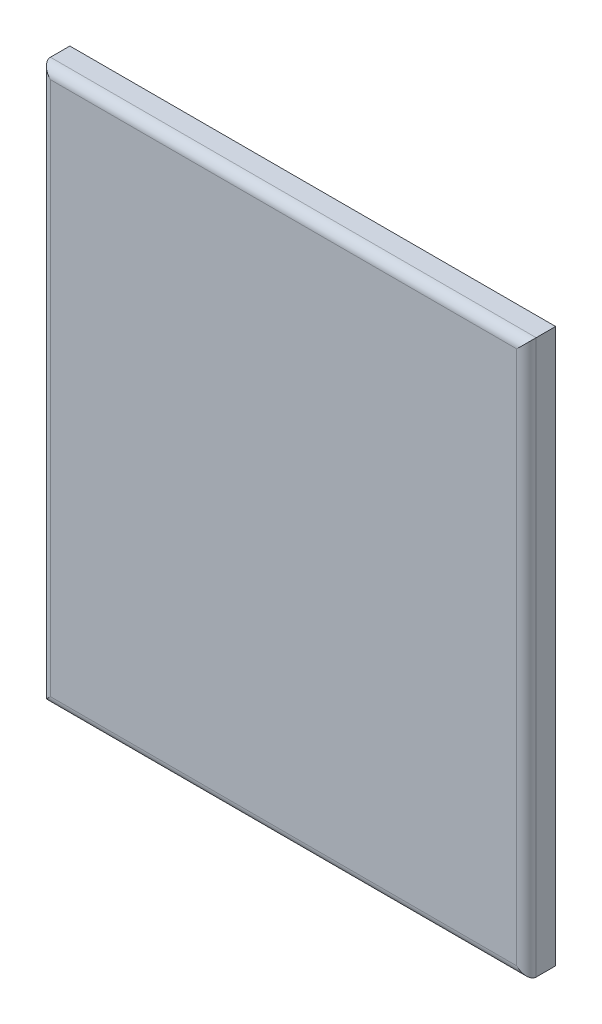
ISO-10303-21;
HEADER;
FILE_DESCRIPTION(('STEP AP214'),'2;1');
FILE_NAME('part.step','',(''),(''),'','','');
FILE_SCHEMA(('AUTOMOTIVE_DESIGN { 1 0 10303 214 1 1 1 1 }'));
ENDSEC;
DATA;
#1=APPLICATION_CONTEXT('core data for automotive mechanical design processes');
#2=APPLICATION_PROTOCOL_DEFINITION('international standard','automotive_design',2000,#1);
#3=PRODUCT_CONTEXT('',#1,'mechanical');
#4=PRODUCT('Part','Part','',(#3));
#5=PRODUCT_RELATED_PRODUCT_CATEGORY('part','',(#4));
#6=PRODUCT_DEFINITION_FORMATION('','',#4);
#7=PRODUCT_DEFINITION_CONTEXT('part definition',#1,'design');
#8=PRODUCT_DEFINITION('design','',#6,#7);
#9=PRODUCT_DEFINITION_SHAPE('','',#8);
#10=(LENGTH_UNIT() NAMED_UNIT(*) SI_UNIT(.MILLI.,.METRE.));
#11=(NAMED_UNIT(*) PLANE_ANGLE_UNIT() SI_UNIT($,.RADIAN.));
#12=(NAMED_UNIT(*) SI_UNIT($,.STERADIAN.) SOLID_ANGLE_UNIT());
#13=UNCERTAINTY_MEASURE_WITH_UNIT(LENGTH_MEASURE(1.E-05),#10,'distance_accuracy_value','');
#14=(GEOMETRIC_REPRESENTATION_CONTEXT(3) GLOBAL_UNCERTAINTY_ASSIGNED_CONTEXT((#13)) GLOBAL_UNIT_ASSIGNED_CONTEXT((#10,
#11,#12)) REPRESENTATION_CONTEXT('',''));
#15=CARTESIAN_POINT('',(0.,0.,0.));
#16=DIRECTION('',(0.,0.,1.));
#17=DIRECTION('',(1.,0.,0.));
#18=AXIS2_PLACEMENT_3D('',#15,#16,#17);
#19=CARTESIAN_POINT('',(0.,0.,30.));
#20=DIRECTION('',(-1.,0.,0.));
#21=DIRECTION('',(0.,0.,1.));
#22=AXIS2_PLACEMENT_3D('',#19,#20,#21);
#23=PLANE('',#22);
#24=DIRECTION('',(0.,0.,-1.));
#25=VECTOR('',#24,1.);
#26=CARTESIAN_POINT('',(0.,0.,30.));
#27=LINE('',#26,#25);
#28=CARTESIAN_POINT('',(0.,0.,20.));
#29=VERTEX_POINT('',#28);
#30=CARTESIAN_POINT('',(0.,0.,0.));
#31=VERTEX_POINT('',#30);
#32=EDGE_CURVE('E86',#29,#31,#27,.T.);
#33=ORIENTED_EDGE('',*,*,#32,.F.);
#34=DIRECTION('',(0.,1.,0.));
#35=VECTOR('',#34,1.);
#36=CARTESIAN_POINT('',(0.,0.,20.));
#37=LINE('',#36,#35);
#38=CARTESIAN_POINT('',(0.,-570.,20.));
#39=VERTEX_POINT('',#38);
#40=EDGE_CURVE('E44',#29,#39,#37,.F.);
#41=ORIENTED_EDGE('',*,*,#40,.T.);
#42=DIRECTION('',(0.,0.,-1.));
#43=VECTOR('',#42,1.);
#44=CARTESIAN_POINT('',(0.,-570.,30.));
#45=LINE('',#44,#43);
#46=CARTESIAN_POINT('',(0.,-570.,0.));
#47=VERTEX_POINT('',#46);
#48=EDGE_CURVE('E103',#39,#47,#45,.T.);
#49=ORIENTED_EDGE('',*,*,#48,.T.);
#50=DIRECTION('',(0.,1.,0.));
#51=VECTOR('',#50,1.);
#52=CARTESIAN_POINT('',(0.,0.,0.));
#53=LINE('',#52,#51);
#54=EDGE_CURVE('E99',#47,#31,#53,.T.);
#55=ORIENTED_EDGE('',*,*,#54,.T.);
#56=EDGE_LOOP('',(#33,#41,#49,#55));
#57=FACE_BOUND('',#56,.T.);
#58=ADVANCED_FACE('F35',(#57),#23,.F.);
#59=CARTESIAN_POINT('',(0.,0.,30.));
#60=DIRECTION('',(0.,-1.,0.));
#61=DIRECTION('',(1.,0.,0.));
#62=AXIS2_PLACEMENT_3D('',#59,#60,#61);
#63=PLANE('',#62);
#64=DIRECTION('',(0.,0.,-1.));
#65=VECTOR('',#64,1.);
#66=CARTESIAN_POINT('',(-500.,0.,30.));
#67=LINE('',#66,#65);
#68=CARTESIAN_POINT('',(-500.,0.,20.));
#69=VERTEX_POINT('',#68);
#70=CARTESIAN_POINT('',(-500.,0.,0.));
#71=VERTEX_POINT('',#70);
#72=EDGE_CURVE('E93',#69,#71,#67,.T.);
#73=ORIENTED_EDGE('',*,*,#72,.F.);
#74=DIRECTION('',(-1.,0.,0.));
#75=VECTOR('',#74,1.);
#76=CARTESIAN_POINT('',(0.,0.,20.));
#77=LINE('',#76,#75);
#78=EDGE_CURVE('E11',#69,#29,#77,.F.);
#79=ORIENTED_EDGE('',*,*,#78,.T.);
#80=ORIENTED_EDGE('',*,*,#32,.T.);
#81=DIRECTION('',(-1.,0.,0.));
#82=VECTOR('',#81,1.);
#83=CARTESIAN_POINT('',(0.,0.,0.));
#84=LINE('',#83,#82);
#85=EDGE_CURVE('E89',#31,#71,#84,.T.);
#86=ORIENTED_EDGE('',*,*,#85,.T.);
#87=EDGE_LOOP('',(#73,#79,#80,#86));
#88=FACE_BOUND('',#87,.T.);
#89=ADVANCED_FACE('F88',(#88),#63,.F.);
#90=CARTESIAN_POINT('',(-500.,0.,30.));
#91=DIRECTION('',(1.,0.,0.));
#92=DIRECTION('',(0.,0.,-1.));
#93=AXIS2_PLACEMENT_3D('',#90,#91,#92);
#94=PLANE('',#93);
#95=DIRECTION('',(0.,0.,-1.));
#96=VECTOR('',#95,1.);
#97=CARTESIAN_POINT('',(-500.,-570.,30.));
#98=LINE('',#97,#96);
#99=CARTESIAN_POINT('',(-500.,-570.,20.));
#100=VERTEX_POINT('',#99);
#101=CARTESIAN_POINT('',(-500.,-570.,0.));
#102=VERTEX_POINT('',#101);
#103=EDGE_CURVE('E113',#100,#102,#98,.T.);
#104=ORIENTED_EDGE('',*,*,#103,.F.);
#105=DIRECTION('',(0.,-1.,0.));
#106=VECTOR('',#105,1.);
#107=CARTESIAN_POINT('',(-500.,0.,20.));
#108=LINE('',#107,#106);
#109=EDGE_CURVE('E124',#100,#69,#108,.F.);
#110=ORIENTED_EDGE('',*,*,#109,.T.);
#111=ORIENTED_EDGE('',*,*,#72,.T.);
#112=DIRECTION('',(0.,-1.,0.));
#113=VECTOR('',#112,1.);
#114=CARTESIAN_POINT('',(-500.,0.,0.));
#115=LINE('',#114,#113);
#116=EDGE_CURVE('E101',#71,#102,#115,.T.);
#117=ORIENTED_EDGE('',*,*,#116,.T.);
#118=EDGE_LOOP('',(#104,#110,#111,#117));
#119=FACE_BOUND('',#118,.T.);
#120=ADVANCED_FACE('F153',(#119),#94,.F.);
#121=CARTESIAN_POINT('',(0.,-570.,30.));
#122=DIRECTION('',(0.,1.,0.));
#123=DIRECTION('',(-1.,0.,0.));
#124=AXIS2_PLACEMENT_3D('',#121,#122,#123);
#125=PLANE('',#124);
#126=ORIENTED_EDGE('',*,*,#48,.F.);
#127=DIRECTION('',(1.,0.,0.));
#128=VECTOR('',#127,1.);
#129=CARTESIAN_POINT('',(0.,-570.,20.));
#130=LINE('',#129,#128);
#131=EDGE_CURVE('E127',#39,#100,#130,.F.);
#132=ORIENTED_EDGE('',*,*,#131,.T.);
#133=ORIENTED_EDGE('',*,*,#103,.T.);
#134=DIRECTION('',(1.,0.,0.));
#135=VECTOR('',#134,1.);
#136=CARTESIAN_POINT('',(0.,-570.,0.));
#137=LINE('',#136,#135);
#138=EDGE_CURVE('E110',#102,#47,#137,.T.);
#139=ORIENTED_EDGE('',*,*,#138,.T.);
#140=EDGE_LOOP('',(#126,#132,#133,#139));
#141=FACE_BOUND('',#140,.T.);
#142=ADVANCED_FACE('F155',(#141),#125,.F.);
#143=CARTESIAN_POINT('',(0.,0.,30.));
#144=DIRECTION('',(0.,0.,-1.));
#145=DIRECTION('',(-1.,0.,0.));
#146=AXIS2_PLACEMENT_3D('',#143,#144,#145);
#147=PLANE('',#146);
#148=DIRECTION('',(-1.,0.,0.));
#149=VECTOR('',#148,1.);
#150=CARTESIAN_POINT('',(0.,-10.,30.));
#151=LINE('',#150,#149);
#152=CARTESIAN_POINT('',(-10.,-10.,30.));
#153=VERTEX_POINT('',#152);
#154=CARTESIAN_POINT('',(-490.,-10.0000000000001,30.));
#155=VERTEX_POINT('',#154);
#156=EDGE_CURVE('E92',#153,#155,#151,.T.);
#157=ORIENTED_EDGE('',*,*,#156,.T.);
#158=DIRECTION('',(0.,-1.,0.));
#159=VECTOR('',#158,1.);
#160=CARTESIAN_POINT('',(-490.,0.,30.));
#161=LINE('',#160,#159);
#162=CARTESIAN_POINT('',(-490.,-560.,30.));
#163=VERTEX_POINT('',#162);
#164=EDGE_CURVE('E121',#155,#163,#161,.T.);
#165=ORIENTED_EDGE('',*,*,#164,.T.);
#166=DIRECTION('',(1.,0.,0.));
#167=VECTOR('',#166,1.);
#168=CARTESIAN_POINT('',(1.24344978758018E-13,-560.,30.));
#169=LINE('',#168,#167);
#170=CARTESIAN_POINT('',(-10.,-560.,30.));
#171=VERTEX_POINT('',#170);
#172=EDGE_CURVE('E119',#163,#171,#169,.T.);
#173=ORIENTED_EDGE('',*,*,#172,.T.);
#174=DIRECTION('',(0.,1.,0.));
#175=VECTOR('',#174,1.);
#176=CARTESIAN_POINT('',(-10.,0.,30.));
#177=LINE('',#176,#175);
#178=EDGE_CURVE('E117',#171,#153,#177,.T.);
#179=ORIENTED_EDGE('',*,*,#178,.T.);
#180=EDGE_LOOP('',(#157,#165,#173,#179));
#181=FACE_BOUND('',#180,.T.);
#182=ADVANCED_FACE('F145',(#181),#147,.F.);
#183=CARTESIAN_POINT('',(0.,0.,0.));
#184=DIRECTION('',(0.,0.,-1.));
#185=DIRECTION('',(-1.,0.,0.));
#186=AXIS2_PLACEMENT_3D('',#183,#184,#185);
#187=PLANE('',#186);
#188=ORIENTED_EDGE('',*,*,#54,.F.);
#189=ORIENTED_EDGE('',*,*,#138,.F.);
#190=ORIENTED_EDGE('',*,*,#116,.F.);
#191=ORIENTED_EDGE('',*,*,#85,.F.);
#192=EDGE_LOOP('',(#188,#189,#190,#191));
#193=FACE_BOUND('',#192,.T.);
#194=ADVANCED_FACE('F97',(#193),#187,.T.);
#195=CARTESIAN_POINT('',(-10.,0.,20.));
#196=DIRECTION('',(0.,1.,0.));
#197=DIRECTION('',(0.,0.,1.));
#198=AXIS2_PLACEMENT_3D('',#195,#196,#197);
#199=CYLINDRICAL_SURFACE('',#198,10.);
#200=CARTESIAN_POINT('',(-10.,-560.,20.));
#201=DIRECTION('',(0.707106781186547,0.707106781186548,0.));
#202=DIRECTION('',(-0.707106781186548,0.707106781186547,0.));
#203=AXIS2_PLACEMENT_3D('',#200,#201,#202);
#204=ELLIPSE('',#203,14.1421356237309,10.);
#205=EDGE_CURVE('E107',#39,#171,#204,.F.);
#206=ORIENTED_EDGE('',*,*,#205,.F.);
#207=ORIENTED_EDGE('',*,*,#40,.F.);
#208=CARTESIAN_POINT('',(-10.,-10.,20.));
#209=DIRECTION('',(-0.707106781186548,0.707106781186547,0.));
#210=DIRECTION('',(-0.707106781186547,-0.707106781186548,0.));
#211=AXIS2_PLACEMENT_3D('',#208,#209,#210);
#212=ELLIPSE('',#211,14.142135623731,10.);
#213=EDGE_CURVE('E39',#153,#29,#212,.T.);
#214=ORIENTED_EDGE('',*,*,#213,.F.);
#215=ORIENTED_EDGE('',*,*,#178,.F.);
#216=EDGE_LOOP('',(#206,#207,#214,#215));
#217=FACE_BOUND('',#216,.T.);
#218=ADVANCED_FACE('F37',(#217),#199,.T.);
#219=CARTESIAN_POINT('',(0.,-10.,20.));
#220=DIRECTION('',(-1.,0.,0.));
#221=DIRECTION('',(0.,-1.,0.));
#222=AXIS2_PLACEMENT_3D('',#219,#220,#221);
#223=CYLINDRICAL_SURFACE('',#222,10.);
#224=ORIENTED_EDGE('',*,*,#213,.T.);
#225=ORIENTED_EDGE('',*,*,#78,.F.);
#226=CARTESIAN_POINT('',(-490.,-10.0000000000001,20.));
#227=DIRECTION('',(-0.707106781186547,-0.707106781186548,0.));
#228=DIRECTION('',(-0.707106781186548,0.707106781186547,0.));
#229=AXIS2_PLACEMENT_3D('',#226,#227,#228);
#230=ELLIPSE('',#229,14.1421356237309,10.);
#231=EDGE_CURVE('E132',#155,#69,#230,.T.);
#232=ORIENTED_EDGE('',*,*,#231,.F.);
#233=ORIENTED_EDGE('',*,*,#156,.F.);
#234=EDGE_LOOP('',(#224,#225,#232,#233));
#235=FACE_BOUND('',#234,.T.);
#236=ADVANCED_FACE('F175',(#235),#223,.T.);
#237=CARTESIAN_POINT('',(1.24344978758018E-13,-560.,20.));
#238=DIRECTION('',(1.,0.,0.));
#239=DIRECTION('',(0.,1.,0.));
#240=AXIS2_PLACEMENT_3D('',#237,#238,#239);
#241=CYLINDRICAL_SURFACE('',#240,10.);
#242=ORIENTED_EDGE('',*,*,#205,.T.);
#243=ORIENTED_EDGE('',*,*,#172,.F.);
#244=CARTESIAN_POINT('',(-490.,-560.,20.));
#245=DIRECTION('',(0.707106781186548,-0.707106781186547,0.));
#246=DIRECTION('',(0.707106781186547,0.707106781186548,0.));
#247=AXIS2_PLACEMENT_3D('',#244,#245,#246);
#248=ELLIPSE('',#247,14.142135623731,10.);
#249=EDGE_CURVE('E130',#100,#163,#248,.F.);
#250=ORIENTED_EDGE('',*,*,#249,.F.);
#251=ORIENTED_EDGE('',*,*,#131,.F.);
#252=EDGE_LOOP('',(#242,#243,#250,#251));
#253=FACE_BOUND('',#252,.T.);
#254=ADVANCED_FACE('F138',(#253),#241,.T.);
#255=CARTESIAN_POINT('',(-490.,0.,20.));
#256=DIRECTION('',(0.,-1.,0.));
#257=DIRECTION('',(0.,0.,-1.));
#258=AXIS2_PLACEMENT_3D('',#255,#256,#257);
#259=CYLINDRICAL_SURFACE('',#258,10.);
#260=ORIENTED_EDGE('',*,*,#231,.T.);
#261=ORIENTED_EDGE('',*,*,#109,.F.);
#262=ORIENTED_EDGE('',*,*,#249,.T.);
#263=ORIENTED_EDGE('',*,*,#164,.F.);
#264=EDGE_LOOP('',(#260,#261,#262,#263));
#265=FACE_BOUND('',#264,.T.);
#266=ADVANCED_FACE('F149',(#265),#259,.T.);
#267=CLOSED_SHELL('',(#58,#89,#120,#142,#182,#194,#218,#236,#254,#266));
#268=MANIFOLD_SOLID_BREP('B2',#267);
#269=ADVANCED_BREP_SHAPE_REPRESENTATION('',(#18,#268),#14);
#270=SHAPE_DEFINITION_REPRESENTATION(#9,#269);
ENDSEC;
END-ISO-10303-21;
